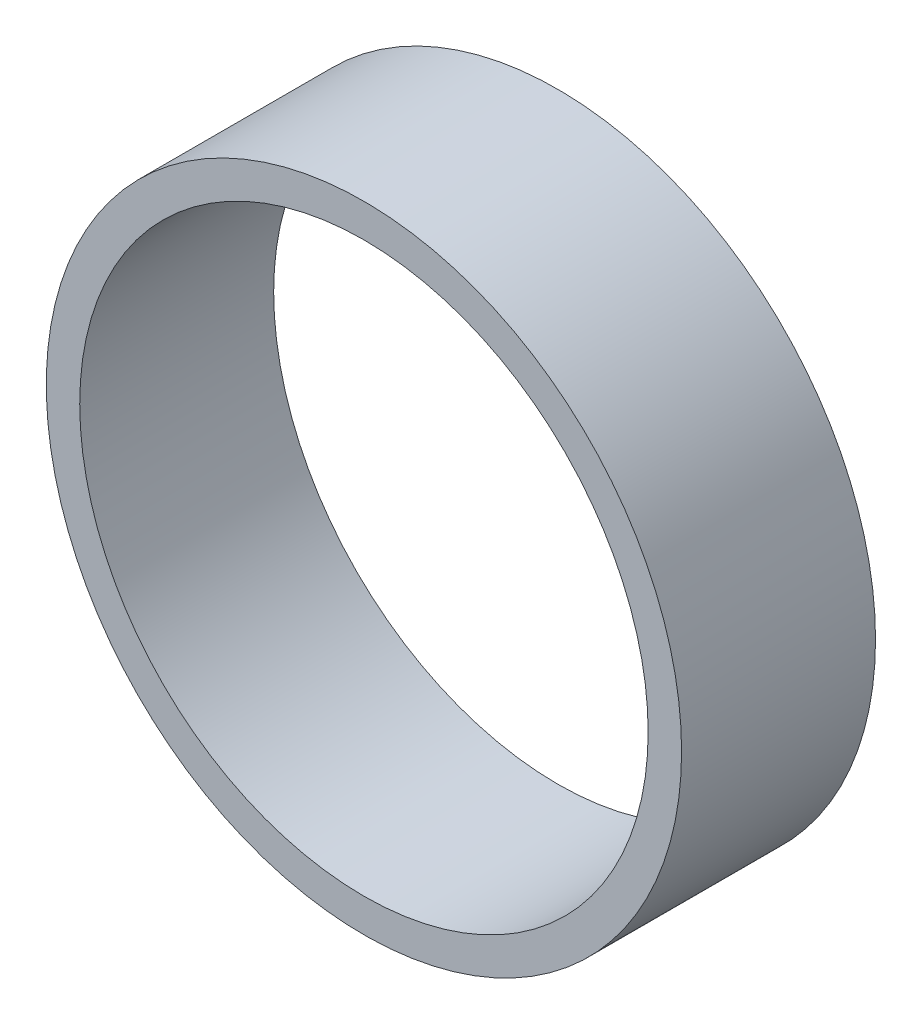
ISO-10303-21;
HEADER;
FILE_DESCRIPTION(('STEP AP214'),'2;1');
FILE_NAME('part.step','',(''),(''),'','','');
FILE_SCHEMA(('AUTOMOTIVE_DESIGN { 1 0 10303 214 1 1 1 1 }'));
ENDSEC;
DATA;
#1=APPLICATION_CONTEXT('core data for automotive mechanical design processes');
#2=APPLICATION_PROTOCOL_DEFINITION('international standard','automotive_design',2000,#1);
#3=PRODUCT_CONTEXT('',#1,'mechanical');
#4=PRODUCT('Part','Part','',(#3));
#5=PRODUCT_RELATED_PRODUCT_CATEGORY('part','',(#4));
#6=PRODUCT_DEFINITION_FORMATION('','',#4);
#7=PRODUCT_DEFINITION_CONTEXT('part definition',#1,'design');
#8=PRODUCT_DEFINITION('design','',#6,#7);
#9=PRODUCT_DEFINITION_SHAPE('','',#8);
#10=(LENGTH_UNIT() NAMED_UNIT(*) SI_UNIT(.MILLI.,.METRE.));
#11=(NAMED_UNIT(*) PLANE_ANGLE_UNIT() SI_UNIT($,.RADIAN.));
#12=(NAMED_UNIT(*) SI_UNIT($,.STERADIAN.) SOLID_ANGLE_UNIT());
#13=UNCERTAINTY_MEASURE_WITH_UNIT(LENGTH_MEASURE(1.E-05),#10,'distance_accuracy_value','');
#14=(GEOMETRIC_REPRESENTATION_CONTEXT(3) GLOBAL_UNCERTAINTY_ASSIGNED_CONTEXT((#13)) GLOBAL_UNIT_ASSIGNED_CONTEXT((#10,
#11,#12)) REPRESENTATION_CONTEXT('',''));
#15=CARTESIAN_POINT('',(0.,0.,0.));
#16=DIRECTION('',(0.,0.,1.));
#17=DIRECTION('',(1.,0.,0.));
#18=AXIS2_PLACEMENT_3D('',#15,#16,#17);
#19=CARTESIAN_POINT('',(-43.2126646474919,1.44186566085188,5.8));
#20=DIRECTION('',(0.,0.,-1.));
#21=DIRECTION('',(-1.,0.,0.));
#22=AXIS2_PLACEMENT_3D('',#19,#20,#21);
#23=CYLINDRICAL_SURFACE('',#22,9.5);
#24=CARTESIAN_POINT('',(-43.2126646474919,1.44186566085188,5.8));
#25=DIRECTION('',(0.,0.,1.));
#26=DIRECTION('',(1.,0.,0.));
#27=AXIS2_PLACEMENT_3D('',#24,#25,#26);
#28=CIRCLE('',#27,9.5);
#29=CARTESIAN_POINT('',(-33.7126646474919,1.44186566085188,5.8));
#30=VERTEX_POINT('',#29);
#31=EDGE_CURVE('E10',#30,#30,#28,.T.);
#32=ORIENTED_EDGE('',*,*,#31,.F.);
#33=EDGE_LOOP('',(#32));
#34=FACE_BOUND('',#33,.T.);
#35=CARTESIAN_POINT('',(-43.2126646474919,1.44186566085188,0.));
#36=DIRECTION('',(0.,0.,1.));
#37=DIRECTION('',(1.,0.,0.));
#38=AXIS2_PLACEMENT_3D('',#35,#36,#37);
#39=CIRCLE('',#38,9.5);
#40=CARTESIAN_POINT('',(-33.7126646474919,1.44186566085188,0.));
#41=VERTEX_POINT('',#40);
#42=EDGE_CURVE('E38',#41,#41,#39,.T.);
#43=ORIENTED_EDGE('',*,*,#42,.T.);
#44=EDGE_LOOP('',(#43));
#45=FACE_BOUND('',#44,.T.);
#46=ADVANCED_FACE('F35',(#34,#45),#23,.T.);
#47=CARTESIAN_POINT('',(-43.2126646474919,1.44186566085188,5.8));
#48=DIRECTION('',(0.,0.,1.));
#49=DIRECTION('',(1.,0.,0.));
#50=AXIS2_PLACEMENT_3D('',#47,#48,#49);
#51=PLANE('',#50);
#52=CARTESIAN_POINT('',(-43.2126646474919,1.44186566085188,5.8));
#53=DIRECTION('',(0.,0.,1.));
#54=DIRECTION('',(1.,0.,0.));
#55=AXIS2_PLACEMENT_3D('',#52,#53,#54);
#56=CIRCLE('',#55,8.5);
#57=CARTESIAN_POINT('',(-34.7126646474919,1.44186566085188,5.8));
#58=VERTEX_POINT('',#57);
#59=EDGE_CURVE('E47',#58,#58,#56,.T.);
#60=ORIENTED_EDGE('',*,*,#59,.F.);
#61=EDGE_LOOP('',(#60));
#62=FACE_BOUND('',#61,.T.);
#63=ORIENTED_EDGE('',*,*,#31,.T.);
#64=EDGE_LOOP('',(#63));
#65=FACE_BOUND('',#64,.T.);
#66=ADVANCED_FACE('F62',(#62,#65),#51,.T.);
#67=CARTESIAN_POINT('',(-43.2126646474919,1.44186566085188,0.));
#68=DIRECTION('',(0.,0.,1.));
#69=DIRECTION('',(1.,0.,0.));
#70=AXIS2_PLACEMENT_3D('',#67,#68,#69);
#71=PLANE('',#70);
#72=CARTESIAN_POINT('',(-43.2126646474919,1.44186566085188,0.));
#73=DIRECTION('',(0.,0.,1.));
#74=DIRECTION('',(1.,0.,0.));
#75=AXIS2_PLACEMENT_3D('',#72,#73,#74);
#76=CIRCLE('',#75,8.5);
#77=CARTESIAN_POINT('',(-34.7126646474919,1.44186566085188,0.));
#78=VERTEX_POINT('',#77);
#79=EDGE_CURVE('E45',#78,#78,#76,.T.);
#80=ORIENTED_EDGE('',*,*,#79,.T.);
#81=EDGE_LOOP('',(#80));
#82=FACE_BOUND('',#81,.T.);
#83=ORIENTED_EDGE('',*,*,#42,.F.);
#84=EDGE_LOOP('',(#83));
#85=FACE_BOUND('',#84,.T.);
#86=ADVANCED_FACE('F53',(#82,#85),#71,.F.);
#87=CARTESIAN_POINT('',(-43.2126646474919,1.44186566085188,0.));
#88=DIRECTION('',(0.,0.,1.));
#89=DIRECTION('',(1.,0.,0.));
#90=AXIS2_PLACEMENT_3D('',#87,#88,#89);
#91=CYLINDRICAL_SURFACE('',#90,8.5);
#92=ORIENTED_EDGE('',*,*,#79,.F.);
#93=EDGE_LOOP('',(#92));
#94=FACE_BOUND('',#93,.T.);
#95=ORIENTED_EDGE('',*,*,#59,.T.);
#96=EDGE_LOOP('',(#95));
#97=FACE_BOUND('',#96,.T.);
#98=ADVANCED_FACE('F56',(#94,#97),#91,.F.);
#99=CLOSED_SHELL('',(#46,#66,#86,#98));
#100=MANIFOLD_SOLID_BREP('B2',#99);
#101=ADVANCED_BREP_SHAPE_REPRESENTATION('',(#18,#100),#14);
#102=SHAPE_DEFINITION_REPRESENTATION(#9,#101);
ENDSEC;
END-ISO-10303-21;
